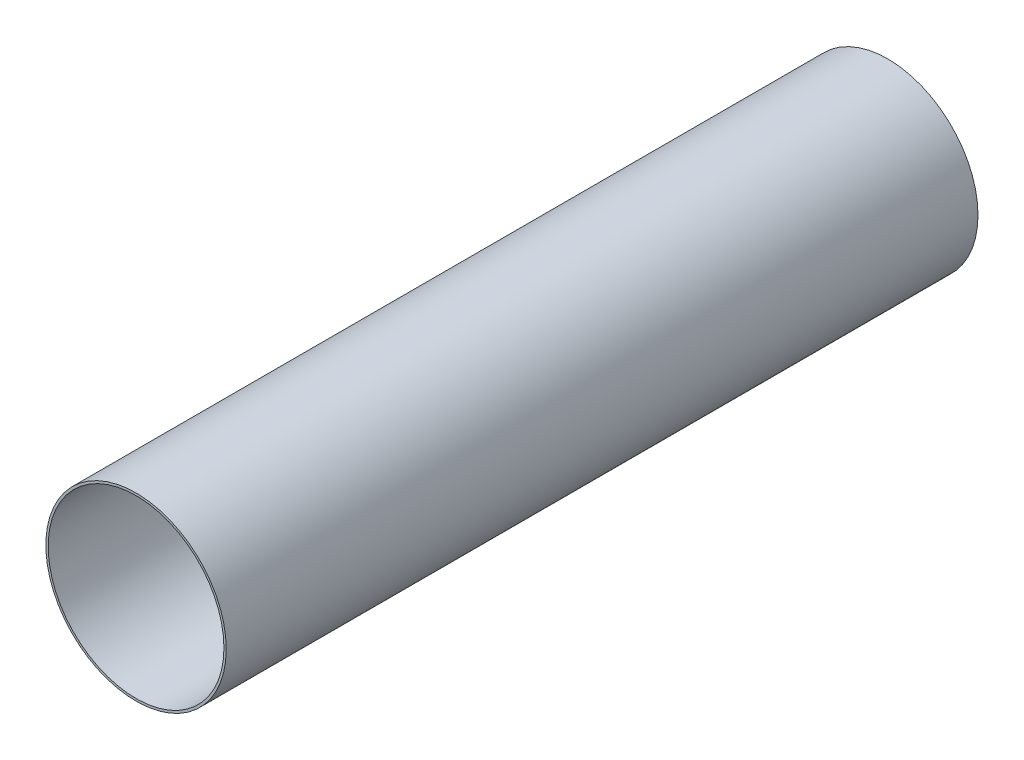
ISO-10303-21;
HEADER;
FILE_DESCRIPTION(('STEP AP214'),'2;1');
FILE_NAME('part.step','',(''),(''),'','','');
FILE_SCHEMA(('AUTOMOTIVE_DESIGN { 1 0 10303 214 1 1 1 1 }'));
ENDSEC;
DATA;
#1=APPLICATION_CONTEXT('core data for automotive mechanical design processes');
#2=APPLICATION_PROTOCOL_DEFINITION('international standard','automotive_design',2000,#1);
#3=PRODUCT_CONTEXT('',#1,'mechanical');
#4=PRODUCT('Part','Part','',(#3));
#5=PRODUCT_RELATED_PRODUCT_CATEGORY('part','',(#4));
#6=PRODUCT_DEFINITION_FORMATION('','',#4);
#7=PRODUCT_DEFINITION_CONTEXT('part definition',#1,'design');
#8=PRODUCT_DEFINITION('design','',#6,#7);
#9=PRODUCT_DEFINITION_SHAPE('','',#8);
#10=(LENGTH_UNIT() NAMED_UNIT(*) SI_UNIT(.MILLI.,.METRE.));
#11=(NAMED_UNIT(*) PLANE_ANGLE_UNIT() SI_UNIT($,.RADIAN.));
#12=(NAMED_UNIT(*) SI_UNIT($,.STERADIAN.) SOLID_ANGLE_UNIT());
#13=UNCERTAINTY_MEASURE_WITH_UNIT(LENGTH_MEASURE(1.E-05),#10,'distance_accuracy_value','');
#14=(GEOMETRIC_REPRESENTATION_CONTEXT(3) GLOBAL_UNCERTAINTY_ASSIGNED_CONTEXT((#13)) GLOBAL_UNIT_ASSIGNED_CONTEXT((#10,
#11,#12)) REPRESENTATION_CONTEXT('',''));
#15=CARTESIAN_POINT('',(0.,0.,0.));
#16=DIRECTION('',(0.,0.,1.));
#17=DIRECTION('',(1.,0.,0.));
#18=AXIS2_PLACEMENT_3D('',#15,#16,#17);
#19=CARTESIAN_POINT('',(0.,0.,650.));
#20=DIRECTION('',(0.,0.,1.));
#21=DIRECTION('',(1.,0.,0.));
#22=AXIS2_PLACEMENT_3D('',#19,#20,#21);
#23=PLANE('',#22);
#24=CARTESIAN_POINT('',(0.,0.,650.));
#25=DIRECTION('',(0.,0.,1.));
#26=DIRECTION('',(1.,0.,0.));
#27=AXIS2_PLACEMENT_3D('',#24,#25,#26);
#28=CIRCLE('',#27,78.);
#29=CARTESIAN_POINT('',(78.,0.,650.));
#30=VERTEX_POINT('',#29);
#31=EDGE_CURVE('E10',#30,#30,#28,.T.);
#32=ORIENTED_EDGE('',*,*,#31,.T.);
#33=EDGE_LOOP('',(#32));
#34=FACE_BOUND('',#33,.T.);
#35=CARTESIAN_POINT('',(0.,0.,650.));
#36=DIRECTION('',(0.,0.,1.));
#37=DIRECTION('',(1.,0.,0.));
#38=AXIS2_PLACEMENT_3D('',#35,#36,#37);
#39=CIRCLE('',#38,76.);
#40=CARTESIAN_POINT('',(76.,0.,650.));
#41=VERTEX_POINT('',#40);
#42=EDGE_CURVE('E50',#41,#41,#39,.T.);
#43=ORIENTED_EDGE('',*,*,#42,.F.);
#44=EDGE_LOOP('',(#43));
#45=FACE_BOUND('',#44,.T.);
#46=ADVANCED_FACE('F37',(#34,#45),#23,.T.);
#47=CARTESIAN_POINT('',(0.,0.,0.));
#48=DIRECTION('',(0.,0.,1.));
#49=DIRECTION('',(1.,0.,0.));
#50=AXIS2_PLACEMENT_3D('',#47,#48,#49);
#51=PLANE('',#50);
#52=CARTESIAN_POINT('',(0.,0.,0.));
#53=DIRECTION('',(0.,0.,1.));
#54=DIRECTION('',(1.,0.,0.));
#55=AXIS2_PLACEMENT_3D('',#52,#53,#54);
#56=CIRCLE('',#55,78.);
#57=CARTESIAN_POINT('',(78.,0.,0.));
#58=VERTEX_POINT('',#57);
#59=EDGE_CURVE('E41',#58,#58,#56,.T.);
#60=ORIENTED_EDGE('',*,*,#59,.F.);
#61=EDGE_LOOP('',(#60));
#62=FACE_BOUND('',#61,.T.);
#63=CARTESIAN_POINT('',(0.,0.,0.));
#64=DIRECTION('',(0.,0.,1.));
#65=DIRECTION('',(1.,0.,0.));
#66=AXIS2_PLACEMENT_3D('',#63,#64,#65);
#67=CIRCLE('',#66,76.);
#68=CARTESIAN_POINT('',(76.,0.,0.));
#69=VERTEX_POINT('',#68);
#70=EDGE_CURVE('E52',#69,#69,#67,.T.);
#71=ORIENTED_EDGE('',*,*,#70,.T.);
#72=EDGE_LOOP('',(#71));
#73=FACE_BOUND('',#72,.T.);
#74=ADVANCED_FACE('F64',(#62,#73),#51,.F.);
#75=CARTESIAN_POINT('',(0.,0.,650.));
#76=DIRECTION('',(0.,0.,-1.));
#77=DIRECTION('',(-1.,0.,0.));
#78=AXIS2_PLACEMENT_3D('',#75,#76,#77);
#79=CYLINDRICAL_SURFACE('',#78,78.);
#80=ORIENTED_EDGE('',*,*,#31,.F.);
#81=EDGE_LOOP('',(#80));
#82=FACE_BOUND('',#81,.T.);
#83=ORIENTED_EDGE('',*,*,#59,.T.);
#84=EDGE_LOOP('',(#83));
#85=FACE_BOUND('',#84,.T.);
#86=ADVANCED_FACE('F39',(#82,#85),#79,.T.);
#87=CARTESIAN_POINT('',(0.,0.,650.));
#88=DIRECTION('',(0.,0.,-1.));
#89=DIRECTION('',(-1.,0.,0.));
#90=AXIS2_PLACEMENT_3D('',#87,#88,#89);
#91=CYLINDRICAL_SURFACE('',#90,76.);
#92=ORIENTED_EDGE('',*,*,#42,.T.);
#93=EDGE_LOOP('',(#92));
#94=FACE_BOUND('',#93,.T.);
#95=ORIENTED_EDGE('',*,*,#70,.F.);
#96=EDGE_LOOP('',(#95));
#97=FACE_BOUND('',#96,.T.);
#98=ADVANCED_FACE('F60',(#94,#97),#91,.F.);
#99=CLOSED_SHELL('',(#46,#74,#86,#98));
#100=MANIFOLD_SOLID_BREP('B2',#99);
#101=ADVANCED_BREP_SHAPE_REPRESENTATION('',(#18,#100),#14);
#102=SHAPE_DEFINITION_REPRESENTATION(#9,#101);
ENDSEC;
END-ISO-10303-21;
